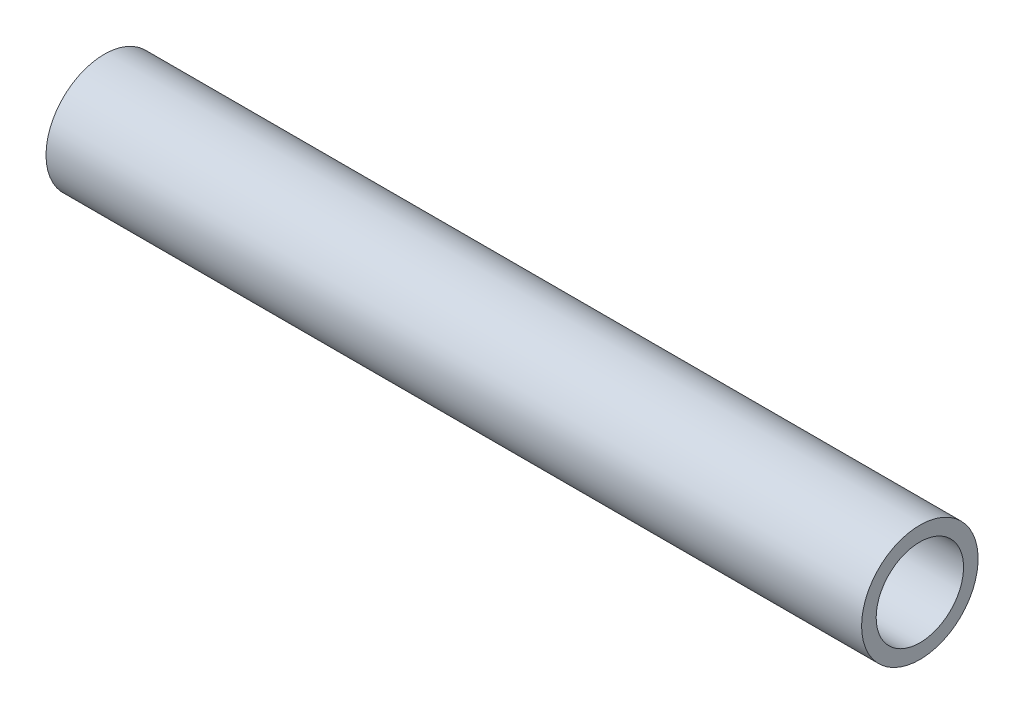
ISO-10303-21;
HEADER;
FILE_DESCRIPTION(('STEP AP214'),'2;1');
FILE_NAME('part.step','',(''),(''),'','','');
FILE_SCHEMA(('AUTOMOTIVE_DESIGN { 1 0 10303 214 1 1 1 1 }'));
ENDSEC;
DATA;
#1=APPLICATION_CONTEXT('core data for automotive mechanical design processes');
#2=APPLICATION_PROTOCOL_DEFINITION('international standard','automotive_design',2000,#1);
#3=PRODUCT_CONTEXT('',#1,'mechanical');
#4=PRODUCT('Part','Part','',(#3));
#5=PRODUCT_RELATED_PRODUCT_CATEGORY('part','',(#4));
#6=PRODUCT_DEFINITION_FORMATION('','',#4);
#7=PRODUCT_DEFINITION_CONTEXT('part definition',#1,'design');
#8=PRODUCT_DEFINITION('design','',#6,#7);
#9=PRODUCT_DEFINITION_SHAPE('','',#8);
#10=(LENGTH_UNIT() NAMED_UNIT(*) SI_UNIT(.MILLI.,.METRE.));
#11=(NAMED_UNIT(*) PLANE_ANGLE_UNIT() SI_UNIT($,.RADIAN.));
#12=(NAMED_UNIT(*) SI_UNIT($,.STERADIAN.) SOLID_ANGLE_UNIT());
#13=UNCERTAINTY_MEASURE_WITH_UNIT(LENGTH_MEASURE(1.E-05),#10,'distance_accuracy_value','');
#14=(GEOMETRIC_REPRESENTATION_CONTEXT(3) GLOBAL_UNCERTAINTY_ASSIGNED_CONTEXT((#13)) GLOBAL_UNIT_ASSIGNED_CONTEXT((#10,
#11,#12)) REPRESENTATION_CONTEXT('',''));
#15=CARTESIAN_POINT('',(0.,0.,0.));
#16=DIRECTION('',(0.,0.,1.));
#17=DIRECTION('',(1.,0.,0.));
#18=AXIS2_PLACEMENT_3D('',#15,#16,#17);
#19=CARTESIAN_POINT('',(30.,10.,0.));
#20=DIRECTION('',(1.,0.,0.));
#21=DIRECTION('',(0.,0.,-1.));
#22=AXIS2_PLACEMENT_3D('',#19,#20,#21);
#23=PLANE('',#22);
#24=CARTESIAN_POINT('',(30.,0.,0.));
#25=DIRECTION('',(-1.,0.,0.));
#26=DIRECTION('',(0.,0.,1.));
#27=AXIS2_PLACEMENT_3D('',#24,#25,#26);
#28=CIRCLE('',#27,7.5);
#29=CARTESIAN_POINT('',(30.,0.,7.5));
#30=VERTEX_POINT('',#29);
#31=EDGE_CURVE('E10',#30,#30,#28,.T.);
#32=ORIENTED_EDGE('',*,*,#31,.F.);
#33=EDGE_LOOP('',(#32));
#34=FACE_BOUND('',#33,.T.);
#35=CARTESIAN_POINT('',(30.,0.,0.));
#36=DIRECTION('',(-1.,0.,0.));
#37=DIRECTION('',(0.,0.,1.));
#38=AXIS2_PLACEMENT_3D('',#35,#36,#37);
#39=CIRCLE('',#38,10.);
#40=CARTESIAN_POINT('',(30.,0.,10.));
#41=VERTEX_POINT('',#40);
#42=EDGE_CURVE('E45',#41,#41,#39,.T.);
#43=ORIENTED_EDGE('',*,*,#42,.T.);
#44=EDGE_LOOP('',(#43));
#45=FACE_BOUND('',#44,.T.);
#46=ADVANCED_FACE('F31',(#34,#45),#23,.F.);
#47=CARTESIAN_POINT('',(0.,0.,0.));
#48=DIRECTION('',(-1.,0.,0.));
#49=DIRECTION('',(0.,0.,1.));
#50=AXIS2_PLACEMENT_3D('',#47,#48,#49);
#51=CYLINDRICAL_SURFACE('',#50,7.5);
#52=CARTESIAN_POINT('',(170.,0.,0.));
#53=DIRECTION('',(-1.,0.,0.));
#54=DIRECTION('',(0.,0.,1.));
#55=AXIS2_PLACEMENT_3D('',#52,#53,#54);
#56=CIRCLE('',#55,7.5);
#57=CARTESIAN_POINT('',(170.,0.,7.5));
#58=VERTEX_POINT('',#57);
#59=EDGE_CURVE('E37',#58,#58,#56,.T.);
#60=ORIENTED_EDGE('',*,*,#59,.F.);
#61=EDGE_LOOP('',(#60));
#62=FACE_BOUND('',#61,.T.);
#63=ORIENTED_EDGE('',*,*,#31,.T.);
#64=EDGE_LOOP('',(#63));
#65=FACE_BOUND('',#64,.T.);
#66=ADVANCED_FACE('F60',(#62,#65),#51,.F.);
#67=CARTESIAN_POINT('',(170.,10.,0.));
#68=DIRECTION('',(-1.,0.,0.));
#69=DIRECTION('',(0.,0.,1.));
#70=AXIS2_PLACEMENT_3D('',#67,#68,#69);
#71=PLANE('',#70);
#72=CARTESIAN_POINT('',(170.,0.,0.));
#73=DIRECTION('',(-1.,0.,0.));
#74=DIRECTION('',(0.,0.,1.));
#75=AXIS2_PLACEMENT_3D('',#72,#73,#74);
#76=CIRCLE('',#75,10.);
#77=CARTESIAN_POINT('',(170.,0.,10.));
#78=VERTEX_POINT('',#77);
#79=EDGE_CURVE('E41',#78,#78,#76,.T.);
#80=ORIENTED_EDGE('',*,*,#79,.F.);
#81=EDGE_LOOP('',(#80));
#82=FACE_BOUND('',#81,.T.);
#83=ORIENTED_EDGE('',*,*,#59,.T.);
#84=EDGE_LOOP('',(#83));
#85=FACE_BOUND('',#84,.T.);
#86=ADVANCED_FACE('F55',(#82,#85),#71,.F.);
#87=CARTESIAN_POINT('',(0.,0.,0.));
#88=DIRECTION('',(-1.,0.,0.));
#89=DIRECTION('',(0.,0.,1.));
#90=AXIS2_PLACEMENT_3D('',#87,#88,#89);
#91=CYLINDRICAL_SURFACE('',#90,10.);
#92=ORIENTED_EDGE('',*,*,#42,.F.);
#93=EDGE_LOOP('',(#92));
#94=FACE_BOUND('',#93,.T.);
#95=ORIENTED_EDGE('',*,*,#79,.T.);
#96=EDGE_LOOP('',(#95));
#97=FACE_BOUND('',#96,.T.);
#98=ADVANCED_FACE('F52',(#94,#97),#91,.T.);
#99=CLOSED_SHELL('',(#46,#66,#86,#98));
#100=MANIFOLD_SOLID_BREP('B2',#99);
#101=ADVANCED_BREP_SHAPE_REPRESENTATION('',(#18,#100),#14);
#102=SHAPE_DEFINITION_REPRESENTATION(#9,#101);
ENDSEC;
END-ISO-10303-21;
